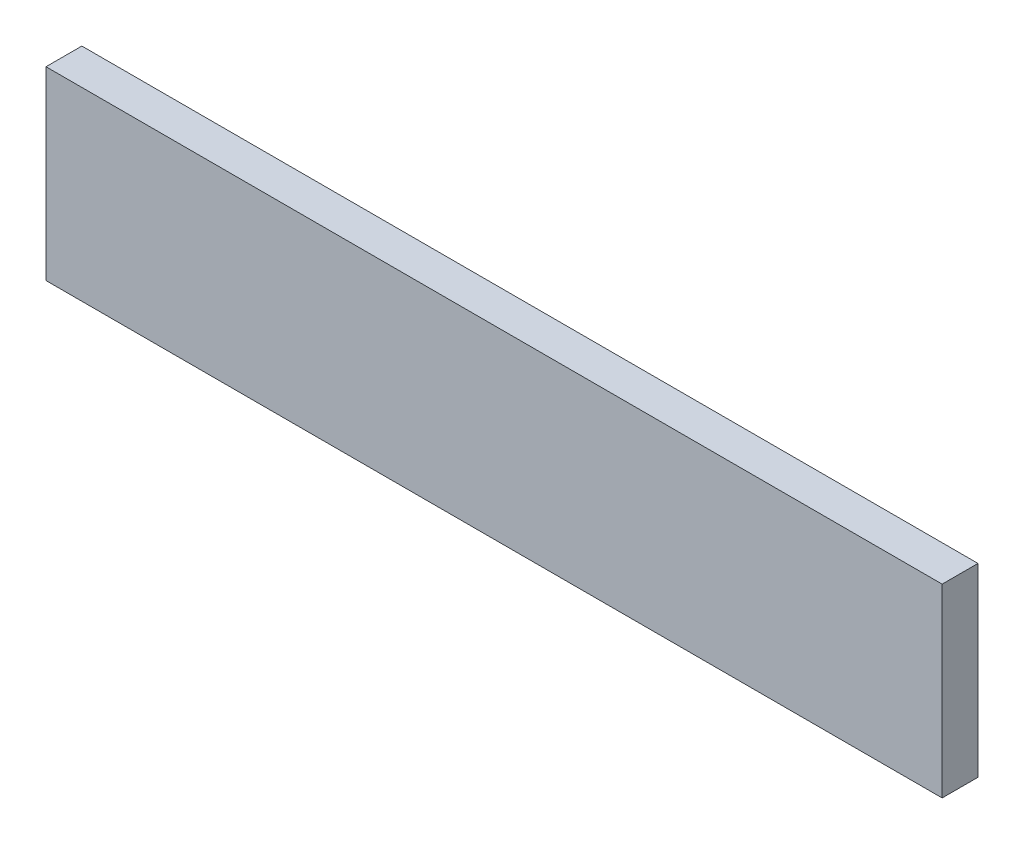
ISO-10303-21;
HEADER;
FILE_DESCRIPTION(('STEP AP214'),'2;1');
FILE_NAME('part.step','',(''),(''),'','','');
FILE_SCHEMA(('AUTOMOTIVE_DESIGN { 1 0 10303 214 1 1 1 1 }'));
ENDSEC;
DATA;
#1=APPLICATION_CONTEXT('core data for automotive mechanical design processes');
#2=APPLICATION_PROTOCOL_DEFINITION('international standard','automotive_design',2000,#1);
#3=PRODUCT_CONTEXT('',#1,'mechanical');
#4=PRODUCT('Part','Part','',(#3));
#5=PRODUCT_RELATED_PRODUCT_CATEGORY('part','',(#4));
#6=PRODUCT_DEFINITION_FORMATION('','',#4);
#7=PRODUCT_DEFINITION_CONTEXT('part definition',#1,'design');
#8=PRODUCT_DEFINITION('design','',#6,#7);
#9=PRODUCT_DEFINITION_SHAPE('','',#8);
#10=(LENGTH_UNIT() NAMED_UNIT(*) SI_UNIT(.MILLI.,.METRE.));
#11=(NAMED_UNIT(*) PLANE_ANGLE_UNIT() SI_UNIT($,.RADIAN.));
#12=(NAMED_UNIT(*) SI_UNIT($,.STERADIAN.) SOLID_ANGLE_UNIT());
#13=UNCERTAINTY_MEASURE_WITH_UNIT(LENGTH_MEASURE(1.E-05),#10,'distance_accuracy_value','');
#14=(GEOMETRIC_REPRESENTATION_CONTEXT(3) GLOBAL_UNCERTAINTY_ASSIGNED_CONTEXT((#13)) GLOBAL_UNIT_ASSIGNED_CONTEXT((#10,
#11,#12)) REPRESENTATION_CONTEXT('',''));
#15=CARTESIAN_POINT('',(0.,0.,0.));
#16=DIRECTION('',(0.,0.,1.));
#17=DIRECTION('',(1.,0.,0.));
#18=AXIS2_PLACEMENT_3D('',#15,#16,#17);
#19=CARTESIAN_POINT('',(-1007.41573033708,60.1348314606742,6.));
#20=DIRECTION('',(1.,0.,0.));
#21=DIRECTION('',(0.,0.,-1.));
#22=AXIS2_PLACEMENT_3D('',#19,#20,#21);
#23=PLANE('',#22);
#24=DIRECTION('',(0.,-1.,0.));
#25=VECTOR('',#24,1.);
#26=CARTESIAN_POINT('',(-1007.41573033708,60.1348314606742,0.));
#27=LINE('',#26,#25);
#28=CARTESIAN_POINT('',(-1007.41573033708,60.1348314606742,0.));
#29=VERTEX_POINT('',#28);
#30=CARTESIAN_POINT('',(-1007.41573033708,29.1348314606742,0.));
#31=VERTEX_POINT('',#30);
#32=EDGE_CURVE('E107',#29,#31,#27,.T.);
#33=ORIENTED_EDGE('',*,*,#32,.T.);
#34=DIRECTION('',(0.,0.,-1.));
#35=VECTOR('',#34,1.);
#36=CARTESIAN_POINT('',(-1007.41573033708,29.1348314606742,6.));
#37=LINE('',#36,#35);
#38=CARTESIAN_POINT('',(-1007.41573033708,29.1348314606742,6.));
#39=VERTEX_POINT('',#38);
#40=EDGE_CURVE('E11',#39,#31,#37,.T.);
#41=ORIENTED_EDGE('',*,*,#40,.F.);
#42=DIRECTION('',(0.,-1.,0.));
#43=VECTOR('',#42,1.);
#44=CARTESIAN_POINT('',(-1007.41573033708,60.1348314606742,6.));
#45=LINE('',#44,#43);
#46=CARTESIAN_POINT('',(-1007.41573033708,60.1348314606742,6.));
#47=VERTEX_POINT('',#46);
#48=EDGE_CURVE('E91',#47,#39,#45,.T.);
#49=ORIENTED_EDGE('',*,*,#48,.F.);
#50=DIRECTION('',(0.,0.,-1.));
#51=VECTOR('',#50,1.);
#52=CARTESIAN_POINT('',(-1007.41573033708,60.1348314606742,6.));
#53=LINE('',#52,#51);
#54=EDGE_CURVE('E103',#47,#29,#53,.T.);
#55=ORIENTED_EDGE('',*,*,#54,.T.);
#56=EDGE_LOOP('',(#33,#41,#49,#55));
#57=FACE_BOUND('',#56,.T.);
#58=ADVANCED_FACE('F39',(#57),#23,.F.);
#59=CARTESIAN_POINT('',(-1007.41573033708,29.1348314606742,6.));
#60=DIRECTION('',(0.,1.,0.));
#61=DIRECTION('',(0.,0.,1.));
#62=AXIS2_PLACEMENT_3D('',#59,#60,#61);
#63=PLANE('',#62);
#64=DIRECTION('',(1.,0.,0.));
#65=VECTOR('',#64,1.);
#66=CARTESIAN_POINT('',(-1007.41573033708,29.1348314606742,0.));
#67=LINE('',#66,#65);
#68=CARTESIAN_POINT('',(-857.415730337079,29.1348314606742,0.));
#69=VERTEX_POINT('',#68);
#70=EDGE_CURVE('E96',#31,#69,#67,.T.);
#71=ORIENTED_EDGE('',*,*,#70,.T.);
#72=DIRECTION('',(0.,0.,-1.));
#73=VECTOR('',#72,1.);
#74=CARTESIAN_POINT('',(-857.415730337079,29.1348314606742,6.));
#75=LINE('',#74,#73);
#76=CARTESIAN_POINT('',(-857.415730337079,29.1348314606742,6.));
#77=VERTEX_POINT('',#76);
#78=EDGE_CURVE('E48',#77,#69,#75,.T.);
#79=ORIENTED_EDGE('',*,*,#78,.F.);
#80=DIRECTION('',(1.,0.,0.));
#81=VECTOR('',#80,1.);
#82=CARTESIAN_POINT('',(-1007.41573033708,29.1348314606742,6.));
#83=LINE('',#82,#81);
#84=EDGE_CURVE('E86',#39,#77,#83,.T.);
#85=ORIENTED_EDGE('',*,*,#84,.F.);
#86=ORIENTED_EDGE('',*,*,#40,.T.);
#87=EDGE_LOOP('',(#71,#79,#85,#86));
#88=FACE_BOUND('',#87,.T.);
#89=ADVANCED_FACE('F95',(#88),#63,.F.);
#90=CARTESIAN_POINT('',(-857.415730337079,60.1348314606742,6.));
#91=DIRECTION('',(-1.,0.,0.));
#92=DIRECTION('',(0.,0.,1.));
#93=AXIS2_PLACEMENT_3D('',#90,#91,#92);
#94=PLANE('',#93);
#95=DIRECTION('',(0.,1.,0.));
#96=VECTOR('',#95,1.);
#97=CARTESIAN_POINT('',(-857.415730337079,60.1348314606742,0.));
#98=LINE('',#97,#96);
#99=CARTESIAN_POINT('',(-857.415730337079,60.1348314606742,0.));
#100=VERTEX_POINT('',#99);
#101=EDGE_CURVE('E73',#69,#100,#98,.T.);
#102=ORIENTED_EDGE('',*,*,#101,.T.);
#103=DIRECTION('',(0.,0.,-1.));
#104=VECTOR('',#103,1.);
#105=CARTESIAN_POINT('',(-857.415730337079,60.1348314606742,6.));
#106=LINE('',#105,#104);
#107=CARTESIAN_POINT('',(-857.415730337079,60.1348314606742,6.));
#108=VERTEX_POINT('',#107);
#109=EDGE_CURVE('E98',#108,#100,#106,.T.);
#110=ORIENTED_EDGE('',*,*,#109,.F.);
#111=DIRECTION('',(0.,1.,0.));
#112=VECTOR('',#111,1.);
#113=CARTESIAN_POINT('',(-857.415730337079,60.1348314606742,6.));
#114=LINE('',#113,#112);
#115=EDGE_CURVE('E89',#77,#108,#114,.T.);
#116=ORIENTED_EDGE('',*,*,#115,.F.);
#117=ORIENTED_EDGE('',*,*,#78,.T.);
#118=EDGE_LOOP('',(#102,#110,#116,#117));
#119=FACE_BOUND('',#118,.T.);
#120=ADVANCED_FACE('F99',(#119),#94,.F.);
#121=CARTESIAN_POINT('',(-1007.41573033708,60.1348314606742,6.));
#122=DIRECTION('',(0.,-1.,0.));
#123=DIRECTION('',(0.,0.,-1.));
#124=AXIS2_PLACEMENT_3D('',#121,#122,#123);
#125=PLANE('',#124);
#126=DIRECTION('',(-1.,0.,0.));
#127=VECTOR('',#126,1.);
#128=CARTESIAN_POINT('',(-1007.41573033708,60.1348314606742,0.));
#129=LINE('',#128,#127);
#130=EDGE_CURVE('E79',#100,#29,#129,.T.);
#131=ORIENTED_EDGE('',*,*,#130,.T.);
#132=ORIENTED_EDGE('',*,*,#54,.F.);
#133=DIRECTION('',(-1.,0.,0.));
#134=VECTOR('',#133,1.);
#135=CARTESIAN_POINT('',(-1007.41573033708,60.1348314606742,6.));
#136=LINE('',#135,#134);
#137=EDGE_CURVE('E56',#108,#47,#136,.T.);
#138=ORIENTED_EDGE('',*,*,#137,.F.);
#139=ORIENTED_EDGE('',*,*,#109,.T.);
#140=EDGE_LOOP('',(#131,#132,#138,#139));
#141=FACE_BOUND('',#140,.T.);
#142=ADVANCED_FACE('F120',(#141),#125,.F.);
#143=CARTESIAN_POINT('',(0.,0.,6.));
#144=DIRECTION('',(0.,0.,1.));
#145=DIRECTION('',(1.,0.,0.));
#146=AXIS2_PLACEMENT_3D('',#143,#144,#145);
#147=PLANE('',#146);
#148=ORIENTED_EDGE('',*,*,#48,.T.);
#149=ORIENTED_EDGE('',*,*,#84,.T.);
#150=ORIENTED_EDGE('',*,*,#115,.T.);
#151=ORIENTED_EDGE('',*,*,#137,.T.);
#152=EDGE_LOOP('',(#148,#149,#150,#151));
#153=FACE_BOUND('',#152,.T.);
#154=ADVANCED_FACE('F87',(#153),#147,.T.);
#155=CARTESIAN_POINT('',(0.,0.,0.));
#156=DIRECTION('',(0.,0.,1.));
#157=DIRECTION('',(1.,0.,0.));
#158=AXIS2_PLACEMENT_3D('',#155,#156,#157);
#159=PLANE('',#158);
#160=ORIENTED_EDGE('',*,*,#32,.F.);
#161=ORIENTED_EDGE('',*,*,#130,.F.);
#162=ORIENTED_EDGE('',*,*,#101,.F.);
#163=ORIENTED_EDGE('',*,*,#70,.F.);
#164=EDGE_LOOP('',(#160,#161,#162,#163));
#165=FACE_BOUND('',#164,.T.);
#166=ADVANCED_FACE('F123',(#165),#159,.F.);
#167=CLOSED_SHELL('',(#58,#89,#120,#142,#154,#166));
#168=MANIFOLD_SOLID_BREP('B2',#167);
#169=ADVANCED_BREP_SHAPE_REPRESENTATION('',(#18,#168),#14);
#170=SHAPE_DEFINITION_REPRESENTATION(#9,#169);
ENDSEC;
END-ISO-10303-21;
